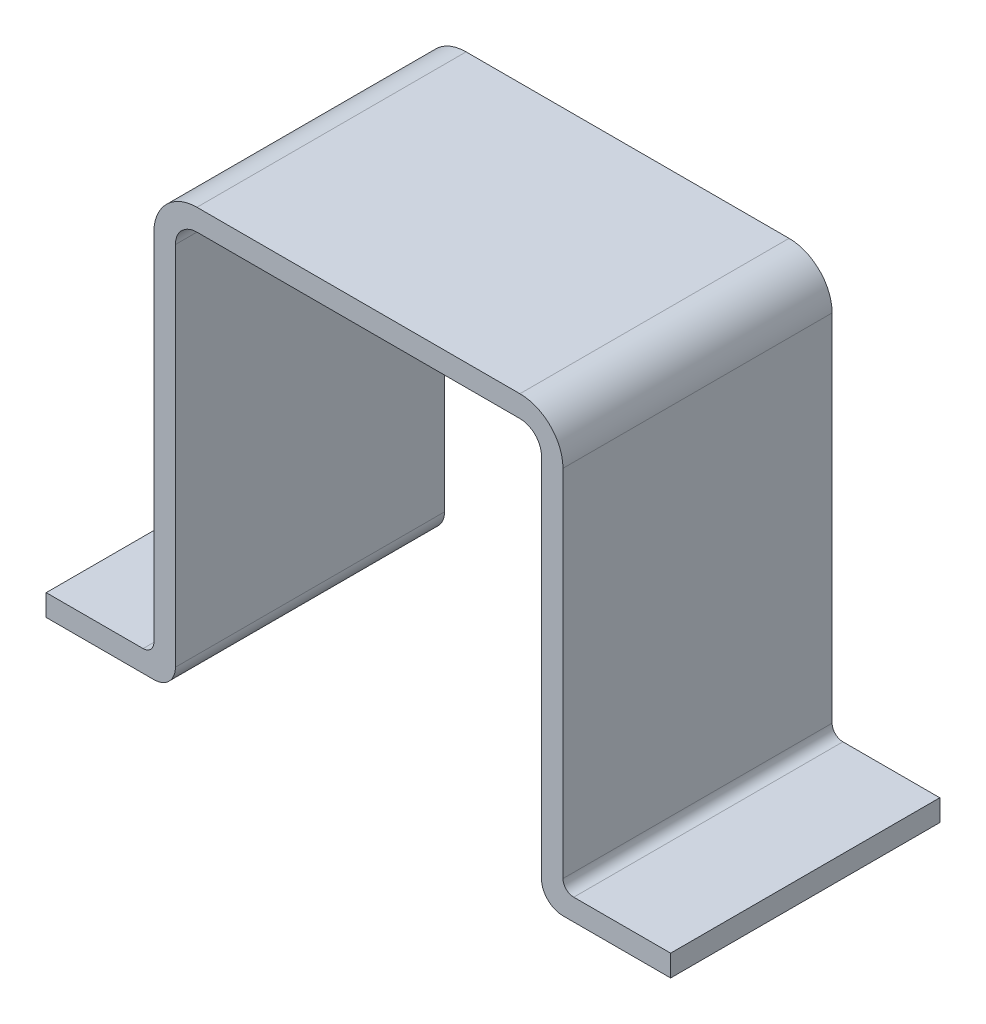
ISO-10303-21;
HEADER;
FILE_DESCRIPTION(('STEP AP214'),'2;1');
FILE_NAME('part.step','',(''),(''),'','','');
FILE_SCHEMA(('AUTOMOTIVE_DESIGN { 1 0 10303 214 1 1 1 1 }'));
ENDSEC;
DATA;
#1=APPLICATION_CONTEXT('core data for automotive mechanical design processes');
#2=APPLICATION_PROTOCOL_DEFINITION('international standard','automotive_design',2000,#1);
#3=PRODUCT_CONTEXT('',#1,'mechanical');
#4=PRODUCT('Part','Part','',(#3));
#5=PRODUCT_RELATED_PRODUCT_CATEGORY('part','',(#4));
#6=PRODUCT_DEFINITION_FORMATION('','',#4);
#7=PRODUCT_DEFINITION_CONTEXT('part definition',#1,'design');
#8=PRODUCT_DEFINITION('design','',#6,#7);
#9=PRODUCT_DEFINITION_SHAPE('','',#8);
#10=(LENGTH_UNIT() NAMED_UNIT(*) SI_UNIT(.MILLI.,.METRE.));
#11=(NAMED_UNIT(*) PLANE_ANGLE_UNIT() SI_UNIT($,.RADIAN.));
#12=(NAMED_UNIT(*) SI_UNIT($,.STERADIAN.) SOLID_ANGLE_UNIT());
#13=UNCERTAINTY_MEASURE_WITH_UNIT(LENGTH_MEASURE(1.E-05),#10,'distance_accuracy_value','');
#14=(GEOMETRIC_REPRESENTATION_CONTEXT(3) GLOBAL_UNCERTAINTY_ASSIGNED_CONTEXT((#13)) GLOBAL_UNIT_ASSIGNED_CONTEXT((#10,
#11,#12)) REPRESENTATION_CONTEXT('',''));
#15=CARTESIAN_POINT('',(0.,0.,0.));
#16=DIRECTION('',(0.,0.,1.));
#17=DIRECTION('',(1.,0.,0.));
#18=AXIS2_PLACEMENT_3D('',#15,#16,#17);
#19=CARTESIAN_POINT('',(15.6266940846495,0.,25.));
#20=DIRECTION('',(0.,1.,0.));
#21=DIRECTION('',(0.,0.,1.));
#22=AXIS2_PLACEMENT_3D('',#19,#20,#21);
#23=PLANE('',#22);
#24=DIRECTION('',(1.,0.,0.));
#25=VECTOR('',#24,1.);
#26=CARTESIAN_POINT('',(15.6266940846495,0.,0.));
#27=LINE('',#26,#25);
#28=CARTESIAN_POINT('',(15.6266940846495,0.,0.));
#29=VERTEX_POINT('',#28);
#30=CARTESIAN_POINT('',(25.6266940846495,0.,0.));
#31=VERTEX_POINT('',#30);
#32=EDGE_CURVE('E184',#29,#31,#27,.T.);
#33=ORIENTED_EDGE('',*,*,#32,.T.);
#34=DIRECTION('',(0.,0.,-1.));
#35=VECTOR('',#34,1.);
#36=CARTESIAN_POINT('',(25.6266940846495,0.,25.));
#37=LINE('',#36,#35);
#38=CARTESIAN_POINT('',(25.6266940846495,0.,25.));
#39=VERTEX_POINT('',#38);
#40=EDGE_CURVE('E182',#39,#31,#37,.T.);
#41=ORIENTED_EDGE('',*,*,#40,.F.);
#42=DIRECTION('',(1.,0.,0.));
#43=VECTOR('',#42,1.);
#44=CARTESIAN_POINT('',(15.6266940846495,0.,25.));
#45=LINE('',#44,#43);
#46=CARTESIAN_POINT('',(15.6266940846495,0.,25.));
#47=VERTEX_POINT('',#46);
#48=EDGE_CURVE('E168',#47,#39,#45,.T.);
#49=ORIENTED_EDGE('',*,*,#48,.F.);
#50=DIRECTION('',(0.,0.,-1.));
#51=VECTOR('',#50,1.);
#52=CARTESIAN_POINT('',(15.6266940846495,0.,25.));
#53=LINE('',#52,#51);
#54=EDGE_CURVE('E233',#47,#29,#53,.T.);
#55=ORIENTED_EDGE('',*,*,#54,.T.);
#56=EDGE_LOOP('',(#33,#41,#49,#55));
#57=FACE_BOUND('',#56,.T.);
#58=ADVANCED_FACE('F33',(#57),#23,.F.);
#59=CARTESIAN_POINT('',(25.6266940846495,2.,25.));
#60=DIRECTION('',(1.,0.,0.));
#61=DIRECTION('',(0.,0.,-1.));
#62=AXIS2_PLACEMENT_3D('',#59,#60,#61);
#63=PLANE('',#62);
#64=DIRECTION('',(0.,-1.,0.));
#65=VECTOR('',#64,1.);
#66=CARTESIAN_POINT('',(25.6266940846495,2.,0.));
#67=LINE('',#66,#65);
#68=CARTESIAN_POINT('',(25.6266940846495,2.,0.));
#69=VERTEX_POINT('',#68);
#70=EDGE_CURVE('E235',#69,#31,#67,.T.);
#71=ORIENTED_EDGE('',*,*,#70,.F.);
#72=DIRECTION('',(0.,0.,-1.));
#73=VECTOR('',#72,1.);
#74=CARTESIAN_POINT('',(25.6266940846495,2.,25.));
#75=LINE('',#74,#73);
#76=CARTESIAN_POINT('',(25.6266940846495,2.,25.));
#77=VERTEX_POINT('',#76);
#78=EDGE_CURVE('E189',#77,#69,#75,.T.);
#79=ORIENTED_EDGE('',*,*,#78,.F.);
#80=DIRECTION('',(0.,-1.,0.));
#81=VECTOR('',#80,1.);
#82=CARTESIAN_POINT('',(25.6266940846495,2.,25.));
#83=LINE('',#82,#81);
#84=EDGE_CURVE('E173',#77,#39,#83,.T.);
#85=ORIENTED_EDGE('',*,*,#84,.T.);
#86=ORIENTED_EDGE('',*,*,#40,.T.);
#87=EDGE_LOOP('',(#71,#79,#85,#86));
#88=FACE_BOUND('',#87,.T.);
#89=ADVANCED_FACE('F192',(#88),#63,.T.);
#90=CARTESIAN_POINT('',(15.6266940846495,2.,25.));
#91=DIRECTION('',(0.,1.,0.));
#92=DIRECTION('',(0.,0.,1.));
#93=AXIS2_PLACEMENT_3D('',#90,#91,#92);
#94=PLANE('',#93);
#95=DIRECTION('',(1.,0.,0.));
#96=VECTOR('',#95,1.);
#97=CARTESIAN_POINT('',(15.6266940846495,2.,0.));
#98=LINE('',#97,#96);
#99=CARTESIAN_POINT('',(16.6266940846495,2.,0.));
#100=VERTEX_POINT('',#99);
#101=EDGE_CURVE('E237',#100,#69,#98,.T.);
#102=ORIENTED_EDGE('',*,*,#101,.F.);
#103=DIRECTION('',(0.,0.,-1.));
#104=VECTOR('',#103,1.);
#105=CARTESIAN_POINT('',(16.6266940846495,2.,25.));
#106=LINE('',#105,#104);
#107=CARTESIAN_POINT('',(16.6266940846495,2.,25.));
#108=VERTEX_POINT('',#107);
#109=EDGE_CURVE('E311',#100,#108,#106,.F.);
#110=ORIENTED_EDGE('',*,*,#109,.T.);
#111=DIRECTION('',(1.,0.,0.));
#112=VECTOR('',#111,1.);
#113=CARTESIAN_POINT('',(15.6266940846495,2.,25.));
#114=LINE('',#113,#112);
#115=EDGE_CURVE('E194',#108,#77,#114,.T.);
#116=ORIENTED_EDGE('',*,*,#115,.T.);
#117=ORIENTED_EDGE('',*,*,#78,.T.);
#118=EDGE_LOOP('',(#102,#110,#116,#117));
#119=FACE_BOUND('',#118,.T.);
#120=ADVANCED_FACE('F333',(#119),#94,.T.);
#121=CARTESIAN_POINT('',(15.6266940846495,36.,25.));
#122=DIRECTION('',(1.,0.,0.));
#123=DIRECTION('',(0.,1.,0.));
#124=AXIS2_PLACEMENT_3D('',#121,#122,#123);
#125=PLANE('',#124);
#126=DIRECTION('',(0.,-1.,0.));
#127=VECTOR('',#126,1.);
#128=CARTESIAN_POINT('',(15.6266940846495,36.,25.));
#129=LINE('',#128,#127);
#130=CARTESIAN_POINT('',(15.6266940846495,36.,25.));
#131=VERTEX_POINT('',#130);
#132=CARTESIAN_POINT('',(15.6266940846495,3.,25.));
#133=VERTEX_POINT('',#132);
#134=EDGE_CURVE('E196',#131,#133,#129,.T.);
#135=ORIENTED_EDGE('',*,*,#134,.T.);
#136=DIRECTION('',(0.,0.,-1.));
#137=VECTOR('',#136,1.);
#138=CARTESIAN_POINT('',(15.6266940846495,3.,0.));
#139=LINE('',#138,#137);
#140=CARTESIAN_POINT('',(15.6266940846495,3.,0.));
#141=VERTEX_POINT('',#140);
#142=EDGE_CURVE('E188',#133,#141,#139,.T.);
#143=ORIENTED_EDGE('',*,*,#142,.T.);
#144=DIRECTION('',(0.,-1.,0.));
#145=VECTOR('',#144,1.);
#146=CARTESIAN_POINT('',(15.6266940846495,36.,0.));
#147=LINE('',#146,#145);
#148=CARTESIAN_POINT('',(15.6266940846495,36.,0.));
#149=VERTEX_POINT('',#148);
#150=EDGE_CURVE('E239',#149,#141,#147,.T.);
#151=ORIENTED_EDGE('',*,*,#150,.F.);
#152=DIRECTION('',(0.,0.,-1.));
#153=VECTOR('',#152,1.);
#154=CARTESIAN_POINT('',(15.6266940846495,36.,25.));
#155=LINE('',#154,#153);
#156=EDGE_CURVE('E306',#131,#149,#155,.T.);
#157=ORIENTED_EDGE('',*,*,#156,.F.);
#158=EDGE_LOOP('',(#135,#143,#151,#157));
#159=FACE_BOUND('',#158,.T.);
#160=ADVANCED_FACE('F327',(#159),#125,.T.);
#161=CARTESIAN_POINT('',(11.6266940846495,36.,25.));
#162=DIRECTION('',(0.,0.,-1.));
#163=DIRECTION('',(-1.,0.,0.));
#164=AXIS2_PLACEMENT_3D('',#161,#162,#163);
#165=CYLINDRICAL_SURFACE('',#164,4.);
#166=CARTESIAN_POINT('',(11.6266940846495,36.,0.));
#167=DIRECTION('',(0.,0.,1.));
#168=DIRECTION('',(1.,0.,0.));
#169=AXIS2_PLACEMENT_3D('',#166,#167,#168);
#170=CIRCLE('',#169,4.);
#171=CARTESIAN_POINT('',(11.6266940846495,40.,0.));
#172=VERTEX_POINT('',#171);
#173=EDGE_CURVE('E242',#172,#149,#170,.F.);
#174=ORIENTED_EDGE('',*,*,#173,.F.);
#175=DIRECTION('',(0.,0.,-1.));
#176=VECTOR('',#175,1.);
#177=CARTESIAN_POINT('',(11.6266940846495,40.,25.));
#178=LINE('',#177,#176);
#179=CARTESIAN_POINT('',(11.6266940846495,40.,25.));
#180=VERTEX_POINT('',#179);
#181=EDGE_CURVE('E304',#180,#172,#178,.T.);
#182=ORIENTED_EDGE('',*,*,#181,.F.);
#183=CARTESIAN_POINT('',(11.6266940846495,36.,25.));
#184=DIRECTION('',(0.,0.,1.));
#185=DIRECTION('',(1.,0.,0.));
#186=AXIS2_PLACEMENT_3D('',#183,#184,#185);
#187=CIRCLE('',#186,4.);
#188=EDGE_CURVE('E201',#180,#131,#187,.F.);
#189=ORIENTED_EDGE('',*,*,#188,.T.);
#190=ORIENTED_EDGE('',*,*,#156,.T.);
#191=EDGE_LOOP('',(#174,#182,#189,#190));
#192=FACE_BOUND('',#191,.T.);
#193=ADVANCED_FACE('F395',(#192),#165,.T.);
#194=CARTESIAN_POINT('',(-18.3733059153505,40.,25.));
#195=DIRECTION('',(0.,1.,0.));
#196=DIRECTION('',(0.,0.,1.));
#197=AXIS2_PLACEMENT_3D('',#194,#195,#196);
#198=PLANE('',#197);
#199=DIRECTION('',(1.,0.,0.));
#200=VECTOR('',#199,1.);
#201=CARTESIAN_POINT('',(-18.3733059153505,40.,0.));
#202=LINE('',#201,#200);
#203=CARTESIAN_POINT('',(-18.3733059153505,40.,0.));
#204=VERTEX_POINT('',#203);
#205=EDGE_CURVE('E245',#204,#172,#202,.T.);
#206=ORIENTED_EDGE('',*,*,#205,.F.);
#207=DIRECTION('',(0.,0.,-1.));
#208=VECTOR('',#207,1.);
#209=CARTESIAN_POINT('',(-18.3733059153505,40.,25.));
#210=LINE('',#209,#208);
#211=CARTESIAN_POINT('',(-18.3733059153505,40.,25.));
#212=VERTEX_POINT('',#211);
#213=EDGE_CURVE('E302',#212,#204,#210,.T.);
#214=ORIENTED_EDGE('',*,*,#213,.F.);
#215=DIRECTION('',(1.,0.,0.));
#216=VECTOR('',#215,1.);
#217=CARTESIAN_POINT('',(-18.3733059153505,40.,25.));
#218=LINE('',#217,#216);
#219=EDGE_CURVE('E204',#212,#180,#218,.T.);
#220=ORIENTED_EDGE('',*,*,#219,.T.);
#221=ORIENTED_EDGE('',*,*,#181,.T.);
#222=EDGE_LOOP('',(#206,#214,#220,#221));
#223=FACE_BOUND('',#222,.T.);
#224=ADVANCED_FACE('F393',(#223),#198,.T.);
#225=CARTESIAN_POINT('',(-18.3733059153505,36.,25.));
#226=DIRECTION('',(0.,0.,-1.));
#227=DIRECTION('',(-1.,0.,0.));
#228=AXIS2_PLACEMENT_3D('',#225,#226,#227);
#229=CYLINDRICAL_SURFACE('',#228,4.);
#230=CARTESIAN_POINT('',(-18.3733059153505,36.,0.));
#231=DIRECTION('',(0.,0.,1.));
#232=DIRECTION('',(1.,0.,0.));
#233=AXIS2_PLACEMENT_3D('',#230,#231,#232);
#234=CIRCLE('',#233,4.);
#235=CARTESIAN_POINT('',(-22.3733059153505,36.,0.));
#236=VERTEX_POINT('',#235);
#237=EDGE_CURVE('E248',#236,#204,#234,.F.);
#238=ORIENTED_EDGE('',*,*,#237,.F.);
#239=DIRECTION('',(0.,0.,-1.));
#240=VECTOR('',#239,1.);
#241=CARTESIAN_POINT('',(-22.3733059153505,36.,25.));
#242=LINE('',#241,#240);
#243=CARTESIAN_POINT('',(-22.3733059153505,36.,25.));
#244=VERTEX_POINT('',#243);
#245=EDGE_CURVE('E299',#244,#236,#242,.T.);
#246=ORIENTED_EDGE('',*,*,#245,.F.);
#247=CARTESIAN_POINT('',(-18.3733059153505,36.,25.));
#248=DIRECTION('',(0.,0.,1.));
#249=DIRECTION('',(1.,0.,0.));
#250=AXIS2_PLACEMENT_3D('',#247,#248,#249);
#251=CIRCLE('',#250,4.);
#252=EDGE_CURVE('E207',#244,#212,#251,.F.);
#253=ORIENTED_EDGE('',*,*,#252,.T.);
#254=ORIENTED_EDGE('',*,*,#213,.T.);
#255=EDGE_LOOP('',(#238,#246,#253,#254));
#256=FACE_BOUND('',#255,.T.);
#257=ADVANCED_FACE('F389',(#256),#229,.T.);
#258=CARTESIAN_POINT('',(-22.3733059153505,2.,25.));
#259=DIRECTION('',(-1.,0.,0.));
#260=DIRECTION('',(0.,0.,1.));
#261=AXIS2_PLACEMENT_3D('',#258,#259,#260);
#262=PLANE('',#261);
#263=DIRECTION('',(0.,1.,0.));
#264=VECTOR('',#263,1.);
#265=CARTESIAN_POINT('',(-22.3733059153505,2.,0.));
#266=LINE('',#265,#264);
#267=CARTESIAN_POINT('',(-22.3733059153505,3.,0.));
#268=VERTEX_POINT('',#267);
#269=EDGE_CURVE('E251',#268,#236,#266,.T.);
#270=ORIENTED_EDGE('',*,*,#269,.F.);
#271=DIRECTION('',(0.,0.,-1.));
#272=VECTOR('',#271,1.);
#273=CARTESIAN_POINT('',(-22.3733059153505,3.,25.));
#274=LINE('',#273,#272);
#275=CARTESIAN_POINT('',(-22.3733059153505,3.,25.));
#276=VERTEX_POINT('',#275);
#277=EDGE_CURVE('E48',#268,#276,#274,.F.);
#278=ORIENTED_EDGE('',*,*,#277,.T.);
#279=DIRECTION('',(0.,1.,0.));
#280=VECTOR('',#279,1.);
#281=CARTESIAN_POINT('',(-22.3733059153505,2.,25.));
#282=LINE('',#281,#280);
#283=EDGE_CURVE('E210',#276,#244,#282,.T.);
#284=ORIENTED_EDGE('',*,*,#283,.T.);
#285=ORIENTED_EDGE('',*,*,#245,.T.);
#286=EDGE_LOOP('',(#270,#278,#284,#285));
#287=FACE_BOUND('',#286,.T.);
#288=ADVANCED_FACE('F386',(#287),#262,.T.);
#289=CARTESIAN_POINT('',(-32.3733059153505,2.,25.));
#290=DIRECTION('',(0.,1.,0.));
#291=DIRECTION('',(0.,0.,1.));
#292=AXIS2_PLACEMENT_3D('',#289,#290,#291);
#293=PLANE('',#292);
#294=DIRECTION('',(1.,0.,0.));
#295=VECTOR('',#294,1.);
#296=CARTESIAN_POINT('',(-32.3733059153505,2.,25.));
#297=LINE('',#296,#295);
#298=CARTESIAN_POINT('',(-32.3733059153505,2.,25.));
#299=VERTEX_POINT('',#298);
#300=CARTESIAN_POINT('',(-23.3733059153505,2.,25.));
#301=VERTEX_POINT('',#300);
#302=EDGE_CURVE('E212',#299,#301,#297,.T.);
#303=ORIENTED_EDGE('',*,*,#302,.T.);
#304=DIRECTION('',(0.,0.,-1.));
#305=VECTOR('',#304,1.);
#306=CARTESIAN_POINT('',(-23.3733059153505,2.,0.));
#307=LINE('',#306,#305);
#308=CARTESIAN_POINT('',(-23.3733059153505,2.,0.));
#309=VERTEX_POINT('',#308);
#310=EDGE_CURVE('E313',#301,#309,#307,.T.);
#311=ORIENTED_EDGE('',*,*,#310,.T.);
#312=DIRECTION('',(1.,0.,0.));
#313=VECTOR('',#312,1.);
#314=CARTESIAN_POINT('',(-32.3733059153505,2.,0.));
#315=LINE('',#314,#313);
#316=CARTESIAN_POINT('',(-32.3733059153505,2.,0.));
#317=VERTEX_POINT('',#316);
#318=EDGE_CURVE('E253',#317,#309,#315,.T.);
#319=ORIENTED_EDGE('',*,*,#318,.F.);
#320=DIRECTION('',(0.,0.,-1.));
#321=VECTOR('',#320,1.);
#322=CARTESIAN_POINT('',(-32.3733059153505,2.,25.));
#323=LINE('',#322,#321);
#324=EDGE_CURVE('E297',#299,#317,#323,.T.);
#325=ORIENTED_EDGE('',*,*,#324,.F.);
#326=EDGE_LOOP('',(#303,#311,#319,#325));
#327=FACE_BOUND('',#326,.T.);
#328=ADVANCED_FACE('F378',(#327),#293,.T.);
#329=CARTESIAN_POINT('',(-32.3733059153505,0.,25.));
#330=DIRECTION('',(-1.,0.,0.));
#331=DIRECTION('',(0.,0.,1.));
#332=AXIS2_PLACEMENT_3D('',#329,#330,#331);
#333=PLANE('',#332);
#334=DIRECTION('',(0.,1.,0.));
#335=VECTOR('',#334,1.);
#336=CARTESIAN_POINT('',(-32.3733059153505,0.,0.));
#337=LINE('',#336,#335);
#338=CARTESIAN_POINT('',(-32.3733059153505,0.,0.));
#339=VERTEX_POINT('',#338);
#340=EDGE_CURVE('E255',#339,#317,#337,.T.);
#341=ORIENTED_EDGE('',*,*,#340,.F.);
#342=DIRECTION('',(0.,0.,-1.));
#343=VECTOR('',#342,1.);
#344=CARTESIAN_POINT('',(-32.3733059153505,0.,25.));
#345=LINE('',#344,#343);
#346=CARTESIAN_POINT('',(-32.3733059153505,0.,25.));
#347=VERTEX_POINT('',#346);
#348=EDGE_CURVE('E295',#347,#339,#345,.T.);
#349=ORIENTED_EDGE('',*,*,#348,.F.);
#350=DIRECTION('',(0.,1.,0.));
#351=VECTOR('',#350,1.);
#352=CARTESIAN_POINT('',(-32.3733059153505,0.,25.));
#353=LINE('',#352,#351);
#354=EDGE_CURVE('E215',#347,#299,#353,.T.);
#355=ORIENTED_EDGE('',*,*,#354,.T.);
#356=ORIENTED_EDGE('',*,*,#324,.T.);
#357=EDGE_LOOP('',(#341,#349,#355,#356));
#358=FACE_BOUND('',#357,.T.);
#359=ADVANCED_FACE('F375',(#358),#333,.T.);
#360=CARTESIAN_POINT('',(-32.3733059153505,0.,25.));
#361=DIRECTION('',(0.,1.,0.));
#362=DIRECTION('',(0.,0.,1.));
#363=AXIS2_PLACEMENT_3D('',#360,#361,#362);
#364=PLANE('',#363);
#365=DIRECTION('',(1.,0.,0.));
#366=VECTOR('',#365,1.);
#367=CARTESIAN_POINT('',(-32.3733059153505,0.,0.));
#368=LINE('',#367,#366);
#369=CARTESIAN_POINT('',(-22.3733059153505,0.,0.));
#370=VERTEX_POINT('',#369);
#371=EDGE_CURVE('E258',#339,#370,#368,.T.);
#372=ORIENTED_EDGE('',*,*,#371,.T.);
#373=DIRECTION('',(0.,0.,-1.));
#374=VECTOR('',#373,1.);
#375=CARTESIAN_POINT('',(-22.3733059153505,0.,25.));
#376=LINE('',#375,#374);
#377=CARTESIAN_POINT('',(-22.3733059153505,0.,25.));
#378=VERTEX_POINT('',#377);
#379=EDGE_CURVE('E292',#378,#370,#376,.T.);
#380=ORIENTED_EDGE('',*,*,#379,.F.);
#381=DIRECTION('',(1.,0.,0.));
#382=VECTOR('',#381,1.);
#383=CARTESIAN_POINT('',(-32.3733059153505,0.,25.));
#384=LINE('',#383,#382);
#385=EDGE_CURVE('E218',#347,#378,#384,.T.);
#386=ORIENTED_EDGE('',*,*,#385,.F.);
#387=ORIENTED_EDGE('',*,*,#348,.T.);
#388=EDGE_LOOP('',(#372,#380,#386,#387));
#389=FACE_BOUND('',#388,.T.);
#390=ADVANCED_FACE('F372',(#389),#364,.F.);
#391=CARTESIAN_POINT('',(-22.3733059153505,2.,25.));
#392=DIRECTION('',(0.,0.,-1.));
#393=DIRECTION('',(-1.,0.,0.));
#394=AXIS2_PLACEMENT_3D('',#391,#392,#393);
#395=CYLINDRICAL_SURFACE('',#394,2.);
#396=CARTESIAN_POINT('',(-22.3733059153505,2.,0.));
#397=DIRECTION('',(0.,0.,1.));
#398=DIRECTION('',(1.,0.,0.));
#399=AXIS2_PLACEMENT_3D('',#396,#397,#398);
#400=CIRCLE('',#399,2.);
#401=CARTESIAN_POINT('',(-20.3733059153505,2.,0.));
#402=VERTEX_POINT('',#401);
#403=EDGE_CURVE('E260',#370,#402,#400,.T.);
#404=ORIENTED_EDGE('',*,*,#403,.T.);
#405=DIRECTION('',(0.,0.,-1.));
#406=VECTOR('',#405,1.);
#407=CARTESIAN_POINT('',(-20.3733059153505,2.,25.));
#408=LINE('',#407,#406);
#409=CARTESIAN_POINT('',(-20.3733059153505,2.,25.));
#410=VERTEX_POINT('',#409);
#411=EDGE_CURVE('E289',#410,#402,#408,.T.);
#412=ORIENTED_EDGE('',*,*,#411,.F.);
#413=CARTESIAN_POINT('',(-22.3733059153505,2.,25.));
#414=DIRECTION('',(0.,0.,1.));
#415=DIRECTION('',(1.,0.,0.));
#416=AXIS2_PLACEMENT_3D('',#413,#414,#415);
#417=CIRCLE('',#416,2.);
#418=EDGE_CURVE('E220',#378,#410,#417,.T.);
#419=ORIENTED_EDGE('',*,*,#418,.F.);
#420=ORIENTED_EDGE('',*,*,#379,.T.);
#421=EDGE_LOOP('',(#404,#412,#419,#420));
#422=FACE_BOUND('',#421,.T.);
#423=ADVANCED_FACE('F367',(#422),#395,.T.);
#424=CARTESIAN_POINT('',(-20.3733059153505,2.,25.));
#425=DIRECTION('',(-1.,0.,0.));
#426=DIRECTION('',(0.,0.,1.));
#427=AXIS2_PLACEMENT_3D('',#424,#425,#426);
#428=PLANE('',#427);
#429=DIRECTION('',(0.,1.,0.));
#430=VECTOR('',#429,1.);
#431=CARTESIAN_POINT('',(-20.3733059153505,2.,0.));
#432=LINE('',#431,#430);
#433=CARTESIAN_POINT('',(-20.3733059153505,36.,0.));
#434=VERTEX_POINT('',#433);
#435=EDGE_CURVE('E262',#402,#434,#432,.T.);
#436=ORIENTED_EDGE('',*,*,#435,.T.);
#437=DIRECTION('',(0.,0.,-1.));
#438=VECTOR('',#437,1.);
#439=CARTESIAN_POINT('',(-20.3733059153505,36.,25.));
#440=LINE('',#439,#438);
#441=CARTESIAN_POINT('',(-20.3733059153505,36.,25.));
#442=VERTEX_POINT('',#441);
#443=EDGE_CURVE('E286',#442,#434,#440,.T.);
#444=ORIENTED_EDGE('',*,*,#443,.F.);
#445=DIRECTION('',(0.,1.,0.));
#446=VECTOR('',#445,1.);
#447=CARTESIAN_POINT('',(-20.3733059153505,2.,25.));
#448=LINE('',#447,#446);
#449=EDGE_CURVE('E222',#410,#442,#448,.T.);
#450=ORIENTED_EDGE('',*,*,#449,.F.);
#451=ORIENTED_EDGE('',*,*,#411,.T.);
#452=EDGE_LOOP('',(#436,#444,#450,#451));
#453=FACE_BOUND('',#452,.T.);
#454=ADVANCED_FACE('F361',(#453),#428,.F.);
#455=CARTESIAN_POINT('',(-18.3733059153505,36.,25.));
#456=DIRECTION('',(0.,0.,-1.));
#457=DIRECTION('',(-1.,0.,0.));
#458=AXIS2_PLACEMENT_3D('',#455,#456,#457);
#459=CYLINDRICAL_SURFACE('',#458,2.);
#460=CARTESIAN_POINT('',(-18.3733059153505,36.,0.));
#461=DIRECTION('',(0.,0.,-1.));
#462=DIRECTION('',(-1.,0.,0.));
#463=AXIS2_PLACEMENT_3D('',#460,#461,#462);
#464=CIRCLE('',#463,2.);
#465=CARTESIAN_POINT('',(-18.3733059153505,38.,0.));
#466=VERTEX_POINT('',#465);
#467=EDGE_CURVE('E264',#434,#466,#464,.T.);
#468=ORIENTED_EDGE('',*,*,#467,.T.);
#469=DIRECTION('',(0.,0.,-1.));
#470=VECTOR('',#469,1.);
#471=CARTESIAN_POINT('',(-18.3733059153505,38.,25.));
#472=LINE('',#471,#470);
#473=CARTESIAN_POINT('',(-18.3733059153505,38.,25.));
#474=VERTEX_POINT('',#473);
#475=EDGE_CURVE('E283',#474,#466,#472,.T.);
#476=ORIENTED_EDGE('',*,*,#475,.F.);
#477=CARTESIAN_POINT('',(-18.3733059153505,36.,25.));
#478=DIRECTION('',(0.,0.,-1.));
#479=DIRECTION('',(-1.,0.,0.));
#480=AXIS2_PLACEMENT_3D('',#477,#478,#479);
#481=CIRCLE('',#480,2.);
#482=EDGE_CURVE('E224',#442,#474,#481,.T.);
#483=ORIENTED_EDGE('',*,*,#482,.F.);
#484=ORIENTED_EDGE('',*,*,#443,.T.);
#485=EDGE_LOOP('',(#468,#476,#483,#484));
#486=FACE_BOUND('',#485,.T.);
#487=ADVANCED_FACE('F357',(#486),#459,.F.);
#488=CARTESIAN_POINT('',(-18.3733059153505,38.,25.));
#489=DIRECTION('',(0.,1.,0.));
#490=DIRECTION('',(0.,0.,1.));
#491=AXIS2_PLACEMENT_3D('',#488,#489,#490);
#492=PLANE('',#491);
#493=DIRECTION('',(1.,0.,0.));
#494=VECTOR('',#493,1.);
#495=CARTESIAN_POINT('',(-18.3733059153505,38.,0.));
#496=LINE('',#495,#494);
#497=CARTESIAN_POINT('',(11.6266940846495,38.,0.));
#498=VERTEX_POINT('',#497);
#499=EDGE_CURVE('E266',#466,#498,#496,.T.);
#500=ORIENTED_EDGE('',*,*,#499,.T.);
#501=DIRECTION('',(0.,0.,-1.));
#502=VECTOR('',#501,1.);
#503=CARTESIAN_POINT('',(11.6266940846495,38.,25.));
#504=LINE('',#503,#502);
#505=CARTESIAN_POINT('',(11.6266940846495,38.,25.));
#506=VERTEX_POINT('',#505);
#507=EDGE_CURVE('E280',#506,#498,#504,.T.);
#508=ORIENTED_EDGE('',*,*,#507,.F.);
#509=DIRECTION('',(1.,0.,0.));
#510=VECTOR('',#509,1.);
#511=CARTESIAN_POINT('',(-18.3733059153505,38.,25.));
#512=LINE('',#511,#510);
#513=EDGE_CURVE('E226',#474,#506,#512,.T.);
#514=ORIENTED_EDGE('',*,*,#513,.F.);
#515=ORIENTED_EDGE('',*,*,#475,.T.);
#516=EDGE_LOOP('',(#500,#508,#514,#515));
#517=FACE_BOUND('',#516,.T.);
#518=ADVANCED_FACE('F352',(#517),#492,.F.);
#519=CARTESIAN_POINT('',(11.6266940846495,36.,25.));
#520=DIRECTION('',(0.,0.,-1.));
#521=DIRECTION('',(-1.,0.,0.));
#522=AXIS2_PLACEMENT_3D('',#519,#520,#521);
#523=CYLINDRICAL_SURFACE('',#522,2.);
#524=CARTESIAN_POINT('',(11.6266940846495,36.,0.));
#525=DIRECTION('',(0.,0.,-1.));
#526=DIRECTION('',(-1.,0.,0.));
#527=AXIS2_PLACEMENT_3D('',#524,#525,#526);
#528=CIRCLE('',#527,2.);
#529=CARTESIAN_POINT('',(13.6266940846495,36.,0.));
#530=VERTEX_POINT('',#529);
#531=EDGE_CURVE('E268',#498,#530,#528,.T.);
#532=ORIENTED_EDGE('',*,*,#531,.T.);
#533=DIRECTION('',(0.,0.,-1.));
#534=VECTOR('',#533,1.);
#535=CARTESIAN_POINT('',(13.6266940846495,36.,25.));
#536=LINE('',#535,#534);
#537=CARTESIAN_POINT('',(13.6266940846495,36.,25.));
#538=VERTEX_POINT('',#537);
#539=EDGE_CURVE('E277',#538,#530,#536,.T.);
#540=ORIENTED_EDGE('',*,*,#539,.F.);
#541=CARTESIAN_POINT('',(11.6266940846495,36.,25.));
#542=DIRECTION('',(0.,0.,-1.));
#543=DIRECTION('',(-1.,0.,0.));
#544=AXIS2_PLACEMENT_3D('',#541,#542,#543);
#545=CIRCLE('',#544,2.);
#546=EDGE_CURVE('E228',#506,#538,#545,.T.);
#547=ORIENTED_EDGE('',*,*,#546,.F.);
#548=ORIENTED_EDGE('',*,*,#507,.T.);
#549=EDGE_LOOP('',(#532,#540,#547,#548));
#550=FACE_BOUND('',#549,.T.);
#551=ADVANCED_FACE('F346',(#550),#523,.F.);
#552=CARTESIAN_POINT('',(13.6266940846495,36.,25.));
#553=DIRECTION('',(1.,0.,0.));
#554=DIRECTION('',(0.,1.,0.));
#555=AXIS2_PLACEMENT_3D('',#552,#553,#554);
#556=PLANE('',#555);
#557=DIRECTION('',(0.,-1.,0.));
#558=VECTOR('',#557,1.);
#559=CARTESIAN_POINT('',(13.6266940846495,36.,0.));
#560=LINE('',#559,#558);
#561=CARTESIAN_POINT('',(13.6266940846495,2.,0.));
#562=VERTEX_POINT('',#561);
#563=EDGE_CURVE('E270',#530,#562,#560,.T.);
#564=ORIENTED_EDGE('',*,*,#563,.T.);
#565=DIRECTION('',(0.,0.,-1.));
#566=VECTOR('',#565,1.);
#567=CARTESIAN_POINT('',(13.6266940846495,2.,25.));
#568=LINE('',#567,#566);
#569=CARTESIAN_POINT('',(13.6266940846495,2.,25.));
#570=VERTEX_POINT('',#569);
#571=EDGE_CURVE('E274',#570,#562,#568,.T.);
#572=ORIENTED_EDGE('',*,*,#571,.F.);
#573=DIRECTION('',(0.,-1.,0.));
#574=VECTOR('',#573,1.);
#575=CARTESIAN_POINT('',(13.6266940846495,36.,25.));
#576=LINE('',#575,#574);
#577=EDGE_CURVE('E230',#538,#570,#576,.T.);
#578=ORIENTED_EDGE('',*,*,#577,.F.);
#579=ORIENTED_EDGE('',*,*,#539,.T.);
#580=EDGE_LOOP('',(#564,#572,#578,#579));
#581=FACE_BOUND('',#580,.T.);
#582=ADVANCED_FACE('F342',(#581),#556,.F.);
#583=CARTESIAN_POINT('',(15.6266940846495,2.,25.));
#584=DIRECTION('',(0.,0.,-1.));
#585=DIRECTION('',(-1.,0.,0.));
#586=AXIS2_PLACEMENT_3D('',#583,#584,#585);
#587=CYLINDRICAL_SURFACE('',#586,2.);
#588=CARTESIAN_POINT('',(15.6266940846495,2.,0.));
#589=DIRECTION('',(0.,0.,1.));
#590=DIRECTION('',(-1.,0.,0.));
#591=AXIS2_PLACEMENT_3D('',#588,#589,#590);
#592=CIRCLE('',#591,2.);
#593=EDGE_CURVE('E179',#562,#29,#592,.T.);
#594=ORIENTED_EDGE('',*,*,#593,.T.);
#595=ORIENTED_EDGE('',*,*,#54,.F.);
#596=CARTESIAN_POINT('',(15.6266940846495,2.,25.));
#597=DIRECTION('',(0.,0.,1.));
#598=DIRECTION('',(-1.,0.,0.));
#599=AXIS2_PLACEMENT_3D('',#596,#597,#598);
#600=CIRCLE('',#599,2.);
#601=EDGE_CURVE('E175',#570,#47,#600,.T.);
#602=ORIENTED_EDGE('',*,*,#601,.F.);
#603=ORIENTED_EDGE('',*,*,#571,.T.);
#604=EDGE_LOOP('',(#594,#595,#602,#603));
#605=FACE_BOUND('',#604,.T.);
#606=ADVANCED_FACE('F338',(#605),#587,.T.);
#607=CARTESIAN_POINT('',(11.6266940846495,36.,25.));
#608=DIRECTION('',(0.,0.,1.));
#609=DIRECTION('',(1.,0.,0.));
#610=AXIS2_PLACEMENT_3D('',#607,#608,#609);
#611=PLANE('',#610);
#612=ORIENTED_EDGE('',*,*,#48,.T.);
#613=ORIENTED_EDGE('',*,*,#84,.F.);
#614=ORIENTED_EDGE('',*,*,#115,.F.);
#615=CARTESIAN_POINT('',(16.6266940846495,3.,25.));
#616=DIRECTION('',(0.,0.,1.));
#617=DIRECTION('',(1.,0.,0.));
#618=AXIS2_PLACEMENT_3D('',#615,#616,#617);
#619=CIRCLE('',#618,1.);
#620=EDGE_CURVE('E319',#108,#133,#619,.F.);
#621=ORIENTED_EDGE('',*,*,#620,.T.);
#622=ORIENTED_EDGE('',*,*,#134,.F.);
#623=ORIENTED_EDGE('',*,*,#188,.F.);
#624=ORIENTED_EDGE('',*,*,#219,.F.);
#625=ORIENTED_EDGE('',*,*,#252,.F.);
#626=ORIENTED_EDGE('',*,*,#283,.F.);
#627=CARTESIAN_POINT('',(-23.3733059153505,3.,25.));
#628=DIRECTION('',(0.,0.,1.));
#629=DIRECTION('',(1.,0.,0.));
#630=AXIS2_PLACEMENT_3D('',#627,#628,#629);
#631=CIRCLE('',#630,1.);
#632=EDGE_CURVE('E11',#276,#301,#631,.F.);
#633=ORIENTED_EDGE('',*,*,#632,.T.);
#634=ORIENTED_EDGE('',*,*,#302,.F.);
#635=ORIENTED_EDGE('',*,*,#354,.F.);
#636=ORIENTED_EDGE('',*,*,#385,.T.);
#637=ORIENTED_EDGE('',*,*,#418,.T.);
#638=ORIENTED_EDGE('',*,*,#449,.T.);
#639=ORIENTED_EDGE('',*,*,#482,.T.);
#640=ORIENTED_EDGE('',*,*,#513,.T.);
#641=ORIENTED_EDGE('',*,*,#546,.T.);
#642=ORIENTED_EDGE('',*,*,#577,.T.);
#643=ORIENTED_EDGE('',*,*,#601,.T.);
#644=EDGE_LOOP('',(#612,#613,#614,#621,#622,#623,#624,#625,#626,#633,#634,#635,#636,#637,#638,
#639,#640,#641,#642,#643));
#645=FACE_BOUND('',#644,.T.);
#646=ADVANCED_FACE('F170',(#645),#611,.T.);
#647=CARTESIAN_POINT('',(11.6266940846495,36.,0.));
#648=DIRECTION('',(0.,0.,1.));
#649=DIRECTION('',(1.,0.,0.));
#650=AXIS2_PLACEMENT_3D('',#647,#648,#649);
#651=PLANE('',#650);
#652=ORIENTED_EDGE('',*,*,#32,.F.);
#653=ORIENTED_EDGE('',*,*,#593,.F.);
#654=ORIENTED_EDGE('',*,*,#563,.F.);
#655=ORIENTED_EDGE('',*,*,#531,.F.);
#656=ORIENTED_EDGE('',*,*,#499,.F.);
#657=ORIENTED_EDGE('',*,*,#467,.F.);
#658=ORIENTED_EDGE('',*,*,#435,.F.);
#659=ORIENTED_EDGE('',*,*,#403,.F.);
#660=ORIENTED_EDGE('',*,*,#371,.F.);
#661=ORIENTED_EDGE('',*,*,#340,.T.);
#662=ORIENTED_EDGE('',*,*,#318,.T.);
#663=CARTESIAN_POINT('',(-23.3733059153505,3.,0.));
#664=DIRECTION('',(0.,0.,1.));
#665=DIRECTION('',(1.,0.,0.));
#666=AXIS2_PLACEMENT_3D('',#663,#664,#665);
#667=CIRCLE('',#666,1.);
#668=EDGE_CURVE('E41',#309,#268,#667,.T.);
#669=ORIENTED_EDGE('',*,*,#668,.T.);
#670=ORIENTED_EDGE('',*,*,#269,.T.);
#671=ORIENTED_EDGE('',*,*,#237,.T.);
#672=ORIENTED_EDGE('',*,*,#205,.T.);
#673=ORIENTED_EDGE('',*,*,#173,.T.);
#674=ORIENTED_EDGE('',*,*,#150,.T.);
#675=CARTESIAN_POINT('',(16.6266940846495,3.,0.));
#676=DIRECTION('',(0.,0.,1.));
#677=DIRECTION('',(1.,0.,0.));
#678=AXIS2_PLACEMENT_3D('',#675,#676,#677);
#679=CIRCLE('',#678,1.);
#680=EDGE_CURVE('E317',#141,#100,#679,.T.);
#681=ORIENTED_EDGE('',*,*,#680,.T.);
#682=ORIENTED_EDGE('',*,*,#101,.T.);
#683=ORIENTED_EDGE('',*,*,#70,.T.);
#684=EDGE_LOOP('',(#652,#653,#654,#655,#656,#657,#658,#659,#660,#661,#662,#669,#670,#671,#672,
#673,#674,#681,#682,#683));
#685=FACE_BOUND('',#684,.T.);
#686=ADVANCED_FACE('F331',(#685),#651,.F.);
#687=CARTESIAN_POINT('',(16.6266940846495,3.,25.));
#688=DIRECTION('',(0.,0.,1.));
#689=DIRECTION('',(1.,0.,0.));
#690=AXIS2_PLACEMENT_3D('',#687,#688,#689);
#691=CYLINDRICAL_SURFACE('',#690,1.);
#692=ORIENTED_EDGE('',*,*,#620,.F.);
#693=ORIENTED_EDGE('',*,*,#109,.F.);
#694=ORIENTED_EDGE('',*,*,#680,.F.);
#695=ORIENTED_EDGE('',*,*,#142,.F.);
#696=EDGE_LOOP('',(#692,#693,#694,#695));
#697=FACE_BOUND('',#696,.T.);
#698=ADVANCED_FACE('F329',(#697),#691,.F.);
#699=CARTESIAN_POINT('',(-23.3733059153505,3.,25.));
#700=DIRECTION('',(0.,0.,1.));
#701=DIRECTION('',(1.,0.,0.));
#702=AXIS2_PLACEMENT_3D('',#699,#700,#701);
#703=CYLINDRICAL_SURFACE('',#702,1.);
#704=ORIENTED_EDGE('',*,*,#632,.F.);
#705=ORIENTED_EDGE('',*,*,#277,.F.);
#706=ORIENTED_EDGE('',*,*,#668,.F.);
#707=ORIENTED_EDGE('',*,*,#310,.F.);
#708=EDGE_LOOP('',(#704,#705,#706,#707));
#709=FACE_BOUND('',#708,.T.);
#710=ADVANCED_FACE('F35',(#709),#703,.F.);
#711=CLOSED_SHELL('',(#58,#89,#120,#160,#193,#224,#257,#288,#328,#359,#390,#423,#454,#487,#518,
#551,#582,#606,#646,#686,#698,#710));
#712=MANIFOLD_SOLID_BREP('B2',#711);
#713=ADVANCED_BREP_SHAPE_REPRESENTATION('',(#18,#712),#14);
#714=SHAPE_DEFINITION_REPRESENTATION(#9,#713);
ENDSEC;
END-ISO-10303-21;
